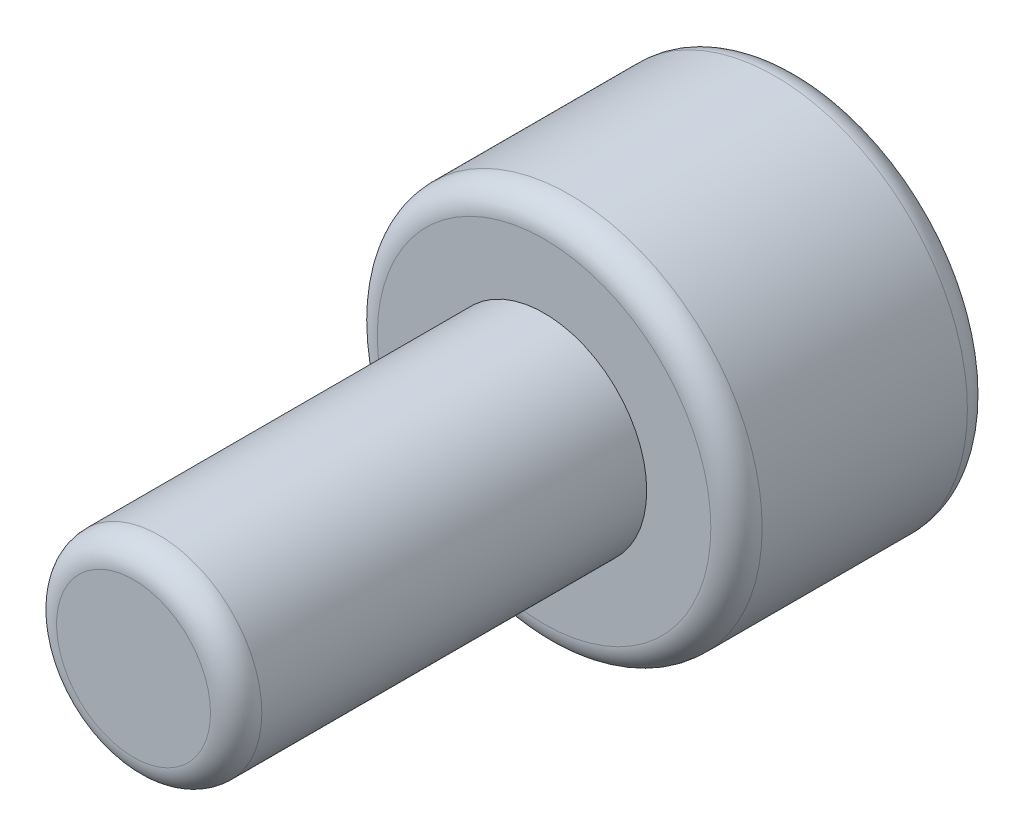
ISO-10303-21;
HEADER;
FILE_DESCRIPTION(('STEP AP214'),'2;1');
FILE_NAME('part.step','',(''),(''),'','','');
FILE_SCHEMA(('AUTOMOTIVE_DESIGN { 1 0 10303 214 1 1 1 1 }'));
ENDSEC;
DATA;
#1=APPLICATION_CONTEXT('core data for automotive mechanical design processes');
#2=APPLICATION_PROTOCOL_DEFINITION('international standard','automotive_design',2000,#1);
#3=PRODUCT_CONTEXT('',#1,'mechanical');
#4=PRODUCT('Part','Part','',(#3));
#5=PRODUCT_RELATED_PRODUCT_CATEGORY('part','',(#4));
#6=PRODUCT_DEFINITION_FORMATION('','',#4);
#7=PRODUCT_DEFINITION_CONTEXT('part definition',#1,'design');
#8=PRODUCT_DEFINITION('design','',#6,#7);
#9=PRODUCT_DEFINITION_SHAPE('','',#8);
#10=(LENGTH_UNIT() NAMED_UNIT(*) SI_UNIT(.MILLI.,.METRE.));
#11=(NAMED_UNIT(*) PLANE_ANGLE_UNIT() SI_UNIT($,.RADIAN.));
#12=(NAMED_UNIT(*) SI_UNIT($,.STERADIAN.) SOLID_ANGLE_UNIT());
#13=UNCERTAINTY_MEASURE_WITH_UNIT(LENGTH_MEASURE(1.E-05),#10,'distance_accuracy_value','');
#14=(GEOMETRIC_REPRESENTATION_CONTEXT(3) GLOBAL_UNCERTAINTY_ASSIGNED_CONTEXT((#13)) GLOBAL_UNIT_ASSIGNED_CONTEXT((#10,
#11,#12)) REPRESENTATION_CONTEXT('',''));
#15=CARTESIAN_POINT('',(0.,0.,0.));
#16=DIRECTION('',(0.,0.,1.));
#17=DIRECTION('',(1.,0.,0.));
#18=AXIS2_PLACEMENT_3D('',#15,#16,#17);
#19=CARTESIAN_POINT('',(0.,0.,8.));
#20=DIRECTION('',(0.,0.,-1.));
#21=DIRECTION('',(-1.,0.,0.));
#22=AXIS2_PLACEMENT_3D('',#19,#20,#21);
#23=CYLINDRICAL_SURFACE('',#22,2.);
#24=CARTESIAN_POINT('',(0.,0.,7.5));
#25=DIRECTION('',(0.,0.,1.));
#26=DIRECTION('',(1.,0.,0.));
#27=AXIS2_PLACEMENT_3D('',#24,#25,#26);
#28=CIRCLE('',#27,2.);
#29=CARTESIAN_POINT('',(2.,0.,7.5));
#30=VERTEX_POINT('',#29);
#31=EDGE_CURVE('E144',#30,#30,#28,.F.);
#32=ORIENTED_EDGE('',*,*,#31,.T.);
#33=EDGE_LOOP('',(#32));
#34=FACE_BOUND('',#33,.T.);
#35=CARTESIAN_POINT('',(0.,0.,0.));
#36=DIRECTION('',(0.,0.,1.));
#37=DIRECTION('',(1.,0.,0.));
#38=AXIS2_PLACEMENT_3D('',#35,#36,#37);
#39=CIRCLE('',#38,2.);
#40=CARTESIAN_POINT('',(2.,0.,0.));
#41=VERTEX_POINT('',#40);
#42=EDGE_CURVE('E178',#41,#41,#39,.T.);
#43=ORIENTED_EDGE('',*,*,#42,.T.);
#44=EDGE_LOOP('',(#43));
#45=FACE_BOUND('',#44,.T.);
#46=ADVANCED_FACE('F45',(#34,#45),#23,.T.);
#47=CARTESIAN_POINT('',(0.,0.,8.));
#48=DIRECTION('',(0.,0.,1.));
#49=DIRECTION('',(1.,0.,0.));
#50=AXIS2_PLACEMENT_3D('',#47,#48,#49);
#51=PLANE('',#50);
#52=CARTESIAN_POINT('',(0.,0.,8.));
#53=DIRECTION('',(0.,0.,1.));
#54=DIRECTION('',(1.,0.,0.));
#55=AXIS2_PLACEMENT_3D('',#52,#53,#54);
#56=CIRCLE('',#55,1.5);
#57=CARTESIAN_POINT('',(1.5,0.,8.));
#58=VERTEX_POINT('',#57);
#59=EDGE_CURVE('E251',#58,#58,#56,.T.);
#60=ORIENTED_EDGE('',*,*,#59,.T.);
#61=EDGE_LOOP('',(#60));
#62=FACE_BOUND('',#61,.T.);
#63=ADVANCED_FACE('F316',(#62),#51,.T.);
#64=CARTESIAN_POINT('',(0.,0.,-5.));
#65=DIRECTION('',(0.,0.,1.));
#66=DIRECTION('',(1.,0.,0.));
#67=AXIS2_PLACEMENT_3D('',#64,#65,#66);
#68=CYLINDRICAL_SURFACE('',#67,3.75);
#69=CARTESIAN_POINT('',(0.,0.,-4.5));
#70=DIRECTION('',(0.,0.,-1.));
#71=DIRECTION('',(-1.,0.,0.));
#72=AXIS2_PLACEMENT_3D('',#69,#70,#71);
#73=CIRCLE('',#72,3.75);
#74=CARTESIAN_POINT('',(-3.75,0.,-4.5));
#75=VERTEX_POINT('',#74);
#76=EDGE_CURVE('E243',#75,#75,#73,.F.);
#77=ORIENTED_EDGE('',*,*,#76,.T.);
#78=EDGE_LOOP('',(#77));
#79=FACE_BOUND('',#78,.T.);
#80=CARTESIAN_POINT('',(0.,0.,-0.5));
#81=DIRECTION('',(0.,0.,-1.));
#82=DIRECTION('',(-1.,0.,0.));
#83=AXIS2_PLACEMENT_3D('',#80,#81,#82);
#84=CIRCLE('',#83,3.75);
#85=CARTESIAN_POINT('',(-3.75,0.,-0.5));
#86=VERTEX_POINT('',#85);
#87=EDGE_CURVE('E239',#86,#86,#84,.T.);
#88=ORIENTED_EDGE('',*,*,#87,.T.);
#89=EDGE_LOOP('',(#88));
#90=FACE_BOUND('',#89,.T.);
#91=ADVANCED_FACE('F322',(#79,#90),#68,.T.);
#92=CARTESIAN_POINT('',(0.,0.,-5.));
#93=DIRECTION('',(0.,0.,-1.));
#94=DIRECTION('',(-1.,0.,0.));
#95=AXIS2_PLACEMENT_3D('',#92,#93,#94);
#96=PLANE('',#95);
#97=CARTESIAN_POINT('',(0.,0.,-5.));
#98=DIRECTION('',(0.,0.,-1.));
#99=DIRECTION('',(-1.,0.,0.));
#100=AXIS2_PLACEMENT_3D('',#97,#98,#99);
#101=CIRCLE('',#100,3.25);
#102=CARTESIAN_POINT('',(-3.25,0.,-5.));
#103=VERTEX_POINT('',#102);
#104=EDGE_CURVE('E235',#103,#103,#101,.T.);
#105=ORIENTED_EDGE('',*,*,#104,.T.);
#106=EDGE_LOOP('',(#105));
#107=FACE_BOUND('',#106,.T.);
#108=DIRECTION('',(0.5,0.866025403784438,0.));
#109=VECTOR('',#108,1.);
#110=CARTESIAN_POINT('',(-1.4,2.42487113059643,-5.));
#111=LINE('',#110,#109);
#112=CARTESIAN_POINT('',(-2.65566243270259,0.250000000000001,-5.));
#113=VERTEX_POINT('',#112);
#114=CARTESIAN_POINT('',(-1.54433756729741,2.17487113059643,-5.));
#115=VERTEX_POINT('',#114);
#116=EDGE_CURVE('E290',#113,#115,#111,.T.);
#117=ORIENTED_EDGE('',*,*,#116,.F.);
#118=CARTESIAN_POINT('',(-2.22264973081037,0.,-5.));
#119=DIRECTION('',(0.,0.,-1.));
#120=DIRECTION('',(-1.,0.,0.));
#121=AXIS2_PLACEMENT_3D('',#118,#119,#120);
#122=CIRCLE('',#121,0.5);
#123=CARTESIAN_POINT('',(-2.65566243270259,-0.249999999999999,-5.));
#124=VERTEX_POINT('',#123);
#125=EDGE_CURVE('E263',#113,#124,#122,.F.);
#126=ORIENTED_EDGE('',*,*,#125,.T.);
#127=DIRECTION('',(-0.5,0.866025403784439,0.));
#128=VECTOR('',#127,1.);
#129=CARTESIAN_POINT('',(-2.8,0.,-5.));
#130=LINE('',#129,#128);
#131=CARTESIAN_POINT('',(-1.54433756729741,-2.17487113059643,-5.));
#132=VERTEX_POINT('',#131);
#133=EDGE_CURVE('E168',#132,#124,#130,.T.);
#134=ORIENTED_EDGE('',*,*,#133,.F.);
#135=CARTESIAN_POINT('',(-1.11132486540519,-1.92487113059643,-5.));
#136=DIRECTION('',(0.,0.,-1.));
#137=DIRECTION('',(-1.,0.,0.));
#138=AXIS2_PLACEMENT_3D('',#135,#136,#137);
#139=CIRCLE('',#138,0.5);
#140=CARTESIAN_POINT('',(-1.11132486540519,-2.42487113059643,-5.));
#141=VERTEX_POINT('',#140);
#142=EDGE_CURVE('E260',#132,#141,#139,.F.);
#143=ORIENTED_EDGE('',*,*,#142,.T.);
#144=DIRECTION('',(-1.,0.,0.));
#145=VECTOR('',#144,1.);
#146=CARTESIAN_POINT('',(-1.4,-2.42487113059643,-5.));
#147=LINE('',#146,#145);
#148=CARTESIAN_POINT('',(1.11132486540519,-2.42487113059643,-5.));
#149=VERTEX_POINT('',#148);
#150=EDGE_CURVE('E162',#149,#141,#147,.T.);
#151=ORIENTED_EDGE('',*,*,#150,.F.);
#152=CARTESIAN_POINT('',(1.11132486540519,-1.92487113059643,-5.));
#153=DIRECTION('',(0.,0.,-1.));
#154=DIRECTION('',(-1.,0.,0.));
#155=AXIS2_PLACEMENT_3D('',#152,#153,#154);
#156=CIRCLE('',#155,0.5);
#157=CARTESIAN_POINT('',(1.5443375672974,-2.17487113059643,-5.));
#158=VERTEX_POINT('',#157);
#159=EDGE_CURVE('E143',#149,#158,#156,.F.);
#160=ORIENTED_EDGE('',*,*,#159,.T.);
#161=DIRECTION('',(-0.500000000000001,-0.866025403784438,0.));
#162=VECTOR('',#161,1.);
#163=CARTESIAN_POINT('',(1.4,-2.42487113059643,-5.));
#164=LINE('',#163,#162);
#165=CARTESIAN_POINT('',(2.65566243270259,-0.250000000000001,-5.));
#166=VERTEX_POINT('',#165);
#167=EDGE_CURVE('E150',#166,#158,#164,.T.);
#168=ORIENTED_EDGE('',*,*,#167,.F.);
#169=CARTESIAN_POINT('',(2.22264973081037,0.,-5.));
#170=DIRECTION('',(0.,0.,-1.));
#171=DIRECTION('',(-1.,0.,0.));
#172=AXIS2_PLACEMENT_3D('',#169,#170,#171);
#173=CIRCLE('',#172,0.5);
#174=CARTESIAN_POINT('',(2.65566243270259,0.249999999999998,-5.));
#175=VERTEX_POINT('',#174);
#176=EDGE_CURVE('E134',#166,#175,#173,.F.);
#177=ORIENTED_EDGE('',*,*,#176,.T.);
#178=DIRECTION('',(0.5,-0.866025403784439,0.));
#179=VECTOR('',#178,1.);
#180=CARTESIAN_POINT('',(2.8,0.,-5.));
#181=LINE('',#180,#179);
#182=CARTESIAN_POINT('',(1.54433756729741,2.17487113059643,-5.));
#183=VERTEX_POINT('',#182);
#184=EDGE_CURVE('E163',#183,#175,#181,.T.);
#185=ORIENTED_EDGE('',*,*,#184,.F.);
#186=CARTESIAN_POINT('',(1.11132486540519,1.92487113059643,-5.));
#187=DIRECTION('',(0.,0.,-1.));
#188=DIRECTION('',(-1.,0.,0.));
#189=AXIS2_PLACEMENT_3D('',#186,#187,#188);
#190=CIRCLE('',#189,0.5);
#191=CARTESIAN_POINT('',(1.11132486540519,2.42487113059643,-5.));
#192=VERTEX_POINT('',#191);
#193=EDGE_CURVE('E54',#183,#192,#190,.F.);
#194=ORIENTED_EDGE('',*,*,#193,.T.);
#195=DIRECTION('',(1.,0.,0.));
#196=VECTOR('',#195,1.);
#197=CARTESIAN_POINT('',(1.4,2.42487113059643,-5.));
#198=LINE('',#197,#196);
#199=CARTESIAN_POINT('',(-1.11132486540519,2.42487113059643,-5.));
#200=VERTEX_POINT('',#199);
#201=EDGE_CURVE('E170',#200,#192,#198,.T.);
#202=ORIENTED_EDGE('',*,*,#201,.F.);
#203=CARTESIAN_POINT('',(-1.11132486540519,1.92487113059643,-5.));
#204=DIRECTION('',(0.,0.,-1.));
#205=DIRECTION('',(-1.,0.,0.));
#206=AXIS2_PLACEMENT_3D('',#203,#204,#205);
#207=CIRCLE('',#206,0.5);
#208=EDGE_CURVE('E11',#200,#115,#207,.F.);
#209=ORIENTED_EDGE('',*,*,#208,.T.);
#210=EDGE_LOOP('',(#117,#126,#134,#143,#151,#160,#168,#177,#185,#194,#202,#209));
#211=FACE_BOUND('',#210,.T.);
#212=ADVANCED_FACE('F159',(#107,#211),#96,.T.);
#213=CARTESIAN_POINT('',(0.,0.,0.));
#214=DIRECTION('',(0.,0.,-1.));
#215=DIRECTION('',(-1.,0.,0.));
#216=AXIS2_PLACEMENT_3D('',#213,#214,#215);
#217=PLANE('',#216);
#218=CARTESIAN_POINT('',(0.,0.,0.));
#219=DIRECTION('',(0.,0.,-1.));
#220=DIRECTION('',(-1.,0.,0.));
#221=AXIS2_PLACEMENT_3D('',#218,#219,#220);
#222=CIRCLE('',#221,3.25);
#223=CARTESIAN_POINT('',(-3.25,0.,0.));
#224=VERTEX_POINT('',#223);
#225=EDGE_CURVE('E247',#224,#224,#222,.F.);
#226=ORIENTED_EDGE('',*,*,#225,.T.);
#227=EDGE_LOOP('',(#226));
#228=FACE_BOUND('',#227,.T.);
#229=ORIENTED_EDGE('',*,*,#42,.F.);
#230=EDGE_LOOP('',(#229));
#231=FACE_BOUND('',#230,.T.);
#232=ADVANCED_FACE('F366',(#228,#231),#217,.F.);
#233=CARTESIAN_POINT('',(-1.4,2.42487113059643,-2.));
#234=DIRECTION('',(-0.866025403784438,0.5,0.));
#235=DIRECTION('',(-0.5,-0.866025403784439,0.));
#236=AXIS2_PLACEMENT_3D('',#233,#234,#235);
#237=PLANE('',#236);
#238=DIRECTION('',(0.5,0.866025403784438,0.));
#239=VECTOR('',#238,1.);
#240=CARTESIAN_POINT('',(-1.4,2.42487113059643,-2.));
#241=LINE('',#240,#239);
#242=CARTESIAN_POINT('',(-2.65566243270259,0.250000000000001,-2.));
#243=VERTEX_POINT('',#242);
#244=CARTESIAN_POINT('',(-1.54433756729741,2.17487113059643,-2.));
#245=VERTEX_POINT('',#244);
#246=EDGE_CURVE('E177',#243,#245,#241,.T.);
#247=ORIENTED_EDGE('',*,*,#246,.F.);
#248=DIRECTION('',(0.,0.,-1.));
#249=VECTOR('',#248,1.);
#250=CARTESIAN_POINT('',(-2.65566243270259,0.250000000000002,-5.));
#251=LINE('',#250,#249);
#252=EDGE_CURVE('E225',#243,#113,#251,.T.);
#253=ORIENTED_EDGE('',*,*,#252,.T.);
#254=ORIENTED_EDGE('',*,*,#116,.T.);
#255=DIRECTION('',(0.,0.,-1.));
#256=VECTOR('',#255,1.);
#257=CARTESIAN_POINT('',(-1.54433756729741,2.17487113059643,-2.));
#258=LINE('',#257,#256);
#259=EDGE_CURVE('E222',#115,#245,#258,.F.);
#260=ORIENTED_EDGE('',*,*,#259,.T.);
#261=EDGE_LOOP('',(#247,#253,#254,#260));
#262=FACE_BOUND('',#261,.T.);
#263=ADVANCED_FACE('F371',(#262),#237,.F.);
#264=CARTESIAN_POINT('',(-2.8,0.,-2.));
#265=DIRECTION('',(-0.866025403784439,-0.5,0.));
#266=DIRECTION('',(0.5,-0.866025403784439,0.));
#267=AXIS2_PLACEMENT_3D('',#264,#265,#266);
#268=PLANE('',#267);
#269=DIRECTION('',(-0.5,0.866025403784439,0.));
#270=VECTOR('',#269,1.);
#271=CARTESIAN_POINT('',(-2.8,0.,-2.));
#272=LINE('',#271,#270);
#273=CARTESIAN_POINT('',(-1.54433756729741,-2.17487113059643,-2.));
#274=VERTEX_POINT('',#273);
#275=CARTESIAN_POINT('',(-2.65566243270259,-0.249999999999999,-2.));
#276=VERTEX_POINT('',#275);
#277=EDGE_CURVE('E182',#274,#276,#272,.T.);
#278=ORIENTED_EDGE('',*,*,#277,.F.);
#279=DIRECTION('',(0.,0.,-1.));
#280=VECTOR('',#279,1.);
#281=CARTESIAN_POINT('',(-1.54433756729741,-2.17487113059643,-5.));
#282=LINE('',#281,#280);
#283=EDGE_CURVE('E218',#274,#132,#282,.T.);
#284=ORIENTED_EDGE('',*,*,#283,.T.);
#285=ORIENTED_EDGE('',*,*,#133,.T.);
#286=DIRECTION('',(0.,0.,-1.));
#287=VECTOR('',#286,1.);
#288=CARTESIAN_POINT('',(-2.65566243270259,-0.249999999999999,-2.));
#289=LINE('',#288,#287);
#290=EDGE_CURVE('E215',#124,#276,#289,.F.);
#291=ORIENTED_EDGE('',*,*,#290,.T.);
#292=EDGE_LOOP('',(#278,#284,#285,#291));
#293=FACE_BOUND('',#292,.T.);
#294=ADVANCED_FACE('F375',(#293),#268,.F.);
#295=CARTESIAN_POINT('',(-1.4,-2.42487113059643,-2.));
#296=DIRECTION('',(0.,-1.,0.));
#297=DIRECTION('',(1.,0.,0.));
#298=AXIS2_PLACEMENT_3D('',#295,#296,#297);
#299=PLANE('',#298);
#300=DIRECTION('',(-1.,0.,0.));
#301=VECTOR('',#300,1.);
#302=CARTESIAN_POINT('',(-1.4,-2.42487113059643,-2.));
#303=LINE('',#302,#301);
#304=CARTESIAN_POINT('',(1.11132486540519,-2.42487113059643,-2.));
#305=VERTEX_POINT('',#304);
#306=CARTESIAN_POINT('',(-1.11132486540519,-2.42487113059643,-2.));
#307=VERTEX_POINT('',#306);
#308=EDGE_CURVE('E269',#305,#307,#303,.T.);
#309=ORIENTED_EDGE('',*,*,#308,.F.);
#310=DIRECTION('',(0.,0.,-1.));
#311=VECTOR('',#310,1.);
#312=CARTESIAN_POINT('',(1.11132486540519,-2.42487113059643,-5.));
#313=LINE('',#312,#311);
#314=EDGE_CURVE('E211',#305,#149,#313,.T.);
#315=ORIENTED_EDGE('',*,*,#314,.T.);
#316=ORIENTED_EDGE('',*,*,#150,.T.);
#317=DIRECTION('',(0.,0.,-1.));
#318=VECTOR('',#317,1.);
#319=CARTESIAN_POINT('',(-1.11132486540519,-2.42487113059643,-2.));
#320=LINE('',#319,#318);
#321=EDGE_CURVE('E208',#141,#307,#320,.F.);
#322=ORIENTED_EDGE('',*,*,#321,.T.);
#323=EDGE_LOOP('',(#309,#315,#316,#322));
#324=FACE_BOUND('',#323,.T.);
#325=ADVANCED_FACE('F313',(#324),#299,.F.);
#326=CARTESIAN_POINT('',(1.4,-2.42487113059643,-2.));
#327=DIRECTION('',(0.866025403784438,-0.500000000000001,0.));
#328=DIRECTION('',(0.500000000000001,0.866025403784438,0.));
#329=AXIS2_PLACEMENT_3D('',#326,#327,#328);
#330=PLANE('',#329);
#331=DIRECTION('',(-0.500000000000001,-0.866025403784438,0.));
#332=VECTOR('',#331,1.);
#333=CARTESIAN_POINT('',(1.4,-2.42487113059643,-2.));
#334=LINE('',#333,#332);
#335=CARTESIAN_POINT('',(2.65566243270259,-0.250000000000001,-2.));
#336=VERTEX_POINT('',#335);
#337=CARTESIAN_POINT('',(1.5443375672974,-2.17487113059643,-2.));
#338=VERTEX_POINT('',#337);
#339=EDGE_CURVE('E153',#336,#338,#334,.T.);
#340=ORIENTED_EDGE('',*,*,#339,.F.);
#341=DIRECTION('',(0.,0.,-1.));
#342=VECTOR('',#341,1.);
#343=CARTESIAN_POINT('',(2.65566243270259,-0.250000000000002,-5.));
#344=LINE('',#343,#342);
#345=EDGE_CURVE('E138',#336,#166,#344,.T.);
#346=ORIENTED_EDGE('',*,*,#345,.T.);
#347=ORIENTED_EDGE('',*,*,#167,.T.);
#348=DIRECTION('',(0.,0.,-1.));
#349=VECTOR('',#348,1.);
#350=CARTESIAN_POINT('',(1.5443375672974,-2.17487113059643,-2.));
#351=LINE('',#350,#349);
#352=EDGE_CURVE('E156',#158,#338,#351,.F.);
#353=ORIENTED_EDGE('',*,*,#352,.T.);
#354=EDGE_LOOP('',(#340,#346,#347,#353));
#355=FACE_BOUND('',#354,.T.);
#356=ADVANCED_FACE('F149',(#355),#330,.F.);
#357=CARTESIAN_POINT('',(2.8,0.,-2.));
#358=DIRECTION('',(0.866025403784439,0.5,0.));
#359=DIRECTION('',(-0.5,0.866025403784439,0.));
#360=AXIS2_PLACEMENT_3D('',#357,#358,#359);
#361=PLANE('',#360);
#362=ORIENTED_EDGE('',*,*,#184,.T.);
#363=DIRECTION('',(0.,0.,-1.));
#364=VECTOR('',#363,1.);
#365=CARTESIAN_POINT('',(2.65566243270259,0.249999999999998,-2.));
#366=LINE('',#365,#364);
#367=CARTESIAN_POINT('',(2.65566243270259,0.249999999999998,-2.));
#368=VERTEX_POINT('',#367);
#369=EDGE_CURVE('E139',#175,#368,#366,.F.);
#370=ORIENTED_EDGE('',*,*,#369,.T.);
#371=DIRECTION('',(0.5,-0.866025403784439,0.));
#372=VECTOR('',#371,1.);
#373=CARTESIAN_POINT('',(2.8,0.,-2.));
#374=LINE('',#373,#372);
#375=CARTESIAN_POINT('',(1.54433756729741,2.17487113059643,-2.));
#376=VERTEX_POINT('',#375);
#377=EDGE_CURVE('E275',#376,#368,#374,.T.);
#378=ORIENTED_EDGE('',*,*,#377,.F.);
#379=DIRECTION('',(0.,0.,-1.));
#380=VECTOR('',#379,1.);
#381=CARTESIAN_POINT('',(1.54433756729741,2.17487113059643,-5.));
#382=LINE('',#381,#380);
#383=EDGE_CURVE('E155',#376,#183,#382,.T.);
#384=ORIENTED_EDGE('',*,*,#383,.T.);
#385=EDGE_LOOP('',(#362,#370,#378,#384));
#386=FACE_BOUND('',#385,.T.);
#387=ADVANCED_FACE('F305',(#386),#361,.F.);
#388=CARTESIAN_POINT('',(1.4,2.42487113059643,-2.));
#389=DIRECTION('',(0.,1.,0.));
#390=DIRECTION('',(-1.,0.,0.));
#391=AXIS2_PLACEMENT_3D('',#388,#389,#390);
#392=PLANE('',#391);
#393=ORIENTED_EDGE('',*,*,#201,.T.);
#394=DIRECTION('',(0.,0.,-1.));
#395=VECTOR('',#394,1.);
#396=CARTESIAN_POINT('',(1.11132486540519,2.42487113059643,-2.));
#397=LINE('',#396,#395);
#398=CARTESIAN_POINT('',(1.11132486540519,2.42487113059643,-2.));
#399=VERTEX_POINT('',#398);
#400=EDGE_CURVE('E232',#192,#399,#397,.F.);
#401=ORIENTED_EDGE('',*,*,#400,.T.);
#402=DIRECTION('',(1.,0.,0.));
#403=VECTOR('',#402,1.);
#404=CARTESIAN_POINT('',(1.4,2.42487113059643,-2.));
#405=LINE('',#404,#403);
#406=CARTESIAN_POINT('',(-1.11132486540519,2.42487113059643,-2.));
#407=VERTEX_POINT('',#406);
#408=EDGE_CURVE('E279',#407,#399,#405,.T.);
#409=ORIENTED_EDGE('',*,*,#408,.F.);
#410=DIRECTION('',(0.,0.,-1.));
#411=VECTOR('',#410,1.);
#412=CARTESIAN_POINT('',(-1.11132486540519,2.42487113059643,-5.));
#413=LINE('',#412,#411);
#414=EDGE_CURVE('E229',#407,#200,#413,.T.);
#415=ORIENTED_EDGE('',*,*,#414,.T.);
#416=EDGE_LOOP('',(#393,#401,#409,#415));
#417=FACE_BOUND('',#416,.T.);
#418=ADVANCED_FACE('F296',(#417),#392,.F.);
#419=CARTESIAN_POINT('',(0.,0.,-2.));
#420=DIRECTION('',(0.,0.,1.));
#421=DIRECTION('',(1.,0.,0.));
#422=AXIS2_PLACEMENT_3D('',#419,#420,#421);
#423=PLANE('',#422);
#424=ORIENTED_EDGE('',*,*,#377,.T.);
#425=CARTESIAN_POINT('',(2.22264973081037,0.,-2.));
#426=DIRECTION('',(0.,0.,1.));
#427=DIRECTION('',(1.,0.,0.));
#428=AXIS2_PLACEMENT_3D('',#425,#426,#427);
#429=CIRCLE('',#428,0.5);
#430=EDGE_CURVE('E205',#368,#336,#429,.F.);
#431=ORIENTED_EDGE('',*,*,#430,.T.);
#432=ORIENTED_EDGE('',*,*,#339,.T.);
#433=CARTESIAN_POINT('',(1.11132486540519,-1.92487113059643,-2.));
#434=DIRECTION('',(0.,0.,1.));
#435=DIRECTION('',(1.,0.,0.));
#436=AXIS2_PLACEMENT_3D('',#433,#434,#435);
#437=CIRCLE('',#436,0.5);
#438=EDGE_CURVE('E202',#338,#305,#437,.F.);
#439=ORIENTED_EDGE('',*,*,#438,.T.);
#440=ORIENTED_EDGE('',*,*,#308,.T.);
#441=CARTESIAN_POINT('',(-1.11132486540519,-1.92487113059643,-2.));
#442=DIRECTION('',(0.,0.,1.));
#443=DIRECTION('',(1.,0.,0.));
#444=AXIS2_PLACEMENT_3D('',#441,#442,#443);
#445=CIRCLE('',#444,0.5);
#446=EDGE_CURVE('E199',#307,#274,#445,.F.);
#447=ORIENTED_EDGE('',*,*,#446,.T.);
#448=ORIENTED_EDGE('',*,*,#277,.T.);
#449=CARTESIAN_POINT('',(-2.22264973081037,0.,-2.));
#450=DIRECTION('',(0.,0.,1.));
#451=DIRECTION('',(1.,0.,0.));
#452=AXIS2_PLACEMENT_3D('',#449,#450,#451);
#453=CIRCLE('',#452,0.5);
#454=EDGE_CURVE('E196',#276,#243,#453,.F.);
#455=ORIENTED_EDGE('',*,*,#454,.T.);
#456=ORIENTED_EDGE('',*,*,#246,.T.);
#457=CARTESIAN_POINT('',(-1.11132486540519,1.92487113059643,-2.));
#458=DIRECTION('',(0.,0.,1.));
#459=DIRECTION('',(1.,0.,0.));
#460=AXIS2_PLACEMENT_3D('',#457,#458,#459);
#461=CIRCLE('',#460,0.5);
#462=EDGE_CURVE('E190',#245,#407,#461,.F.);
#463=ORIENTED_EDGE('',*,*,#462,.T.);
#464=ORIENTED_EDGE('',*,*,#408,.T.);
#465=CARTESIAN_POINT('',(1.11132486540519,1.92487113059643,-2.));
#466=DIRECTION('',(0.,0.,1.));
#467=DIRECTION('',(1.,0.,0.));
#468=AXIS2_PLACEMENT_3D('',#465,#466,#467);
#469=CIRCLE('',#468,0.5);
#470=EDGE_CURVE('E193',#399,#376,#469,.F.);
#471=ORIENTED_EDGE('',*,*,#470,.T.);
#472=EDGE_LOOP('',(#424,#431,#432,#439,#440,#447,#448,#455,#456,#463,#464,#471));
#473=FACE_BOUND('',#472,.T.);
#474=ADVANCED_FACE('F303',(#473),#423,.F.);
#475=CARTESIAN_POINT('',(2.22264973081037,0.,-2.));
#476=DIRECTION('',(0.,0.,1.));
#477=DIRECTION('',(1.,0.,0.));
#478=AXIS2_PLACEMENT_3D('',#475,#476,#477);
#479=CYLINDRICAL_SURFACE('',#478,0.5);
#480=ORIENTED_EDGE('',*,*,#430,.F.);
#481=ORIENTED_EDGE('',*,*,#369,.F.);
#482=ORIENTED_EDGE('',*,*,#176,.F.);
#483=ORIENTED_EDGE('',*,*,#345,.F.);
#484=EDGE_LOOP('',(#480,#481,#482,#483));
#485=FACE_BOUND('',#484,.T.);
#486=ADVANCED_FACE('F137',(#485),#479,.F.);
#487=CARTESIAN_POINT('',(1.11132486540519,-1.92487113059643,-2.));
#488=DIRECTION('',(0.,0.,1.));
#489=DIRECTION('',(1.,0.,0.));
#490=AXIS2_PLACEMENT_3D('',#487,#488,#489);
#491=CYLINDRICAL_SURFACE('',#490,0.5);
#492=ORIENTED_EDGE('',*,*,#438,.F.);
#493=ORIENTED_EDGE('',*,*,#352,.F.);
#494=ORIENTED_EDGE('',*,*,#159,.F.);
#495=ORIENTED_EDGE('',*,*,#314,.F.);
#496=EDGE_LOOP('',(#492,#493,#494,#495));
#497=FACE_BOUND('',#496,.T.);
#498=ADVANCED_FACE('F330',(#497),#491,.F.);
#499=CARTESIAN_POINT('',(-1.11132486540519,-1.92487113059643,-2.));
#500=DIRECTION('',(0.,0.,1.));
#501=DIRECTION('',(1.,0.,0.));
#502=AXIS2_PLACEMENT_3D('',#499,#500,#501);
#503=CYLINDRICAL_SURFACE('',#502,0.5);
#504=ORIENTED_EDGE('',*,*,#446,.F.);
#505=ORIENTED_EDGE('',*,*,#321,.F.);
#506=ORIENTED_EDGE('',*,*,#142,.F.);
#507=ORIENTED_EDGE('',*,*,#283,.F.);
#508=EDGE_LOOP('',(#504,#505,#506,#507));
#509=FACE_BOUND('',#508,.T.);
#510=ADVANCED_FACE('F333',(#509),#503,.F.);
#511=CARTESIAN_POINT('',(-2.22264973081037,0.,-2.));
#512=DIRECTION('',(0.,0.,1.));
#513=DIRECTION('',(1.,0.,0.));
#514=AXIS2_PLACEMENT_3D('',#511,#512,#513);
#515=CYLINDRICAL_SURFACE('',#514,0.5);
#516=ORIENTED_EDGE('',*,*,#454,.F.);
#517=ORIENTED_EDGE('',*,*,#290,.F.);
#518=ORIENTED_EDGE('',*,*,#125,.F.);
#519=ORIENTED_EDGE('',*,*,#252,.F.);
#520=EDGE_LOOP('',(#516,#517,#518,#519));
#521=FACE_BOUND('',#520,.T.);
#522=ADVANCED_FACE('F337',(#521),#515,.F.);
#523=CARTESIAN_POINT('',(1.11132486540519,1.92487113059643,-2.));
#524=DIRECTION('',(0.,0.,1.));
#525=DIRECTION('',(1.,0.,0.));
#526=AXIS2_PLACEMENT_3D('',#523,#524,#525);
#527=CYLINDRICAL_SURFACE('',#526,0.5);
#528=ORIENTED_EDGE('',*,*,#470,.F.);
#529=ORIENTED_EDGE('',*,*,#400,.F.);
#530=ORIENTED_EDGE('',*,*,#193,.F.);
#531=ORIENTED_EDGE('',*,*,#383,.F.);
#532=EDGE_LOOP('',(#528,#529,#530,#531));
#533=FACE_BOUND('',#532,.T.);
#534=ADVANCED_FACE('F300',(#533),#527,.F.);
#535=CARTESIAN_POINT('',(-1.11132486540519,1.92487113059643,-2.));
#536=DIRECTION('',(0.,0.,1.));
#537=DIRECTION('',(1.,0.,0.));
#538=AXIS2_PLACEMENT_3D('',#535,#536,#537);
#539=CYLINDRICAL_SURFACE('',#538,0.5);
#540=ORIENTED_EDGE('',*,*,#462,.F.);
#541=ORIENTED_EDGE('',*,*,#259,.F.);
#542=ORIENTED_EDGE('',*,*,#208,.F.);
#543=ORIENTED_EDGE('',*,*,#414,.F.);
#544=EDGE_LOOP('',(#540,#541,#542,#543));
#545=FACE_BOUND('',#544,.T.);
#546=ADVANCED_FACE('F344',(#545),#539,.F.);
#547=CARTESIAN_POINT('',(0.,0.,-4.5));
#548=DIRECTION('',(0.,0.,-1.));
#549=DIRECTION('',(-1.,0.,0.));
#550=AXIS2_PLACEMENT_3D('',#547,#548,#549);
#551=TOROIDAL_SURFACE('',#550,3.25,0.5);
#552=ORIENTED_EDGE('',*,*,#76,.F.);
#553=EDGE_LOOP('',(#552));
#554=FACE_BOUND('',#553,.T.);
#555=ORIENTED_EDGE('',*,*,#104,.F.);
#556=EDGE_LOOP('',(#555));
#557=FACE_BOUND('',#556,.T.);
#558=ADVANCED_FACE('F347',(#554,#557),#551,.T.);
#559=CARTESIAN_POINT('',(0.,0.,-0.5));
#560=DIRECTION('',(0.,0.,-1.));
#561=DIRECTION('',(-1.,0.,0.));
#562=AXIS2_PLACEMENT_3D('',#559,#560,#561);
#563=TOROIDAL_SURFACE('',#562,3.25,0.5);
#564=ORIENTED_EDGE('',*,*,#225,.F.);
#565=EDGE_LOOP('',(#564));
#566=FACE_BOUND('',#565,.T.);
#567=ORIENTED_EDGE('',*,*,#87,.F.);
#568=EDGE_LOOP('',(#567));
#569=FACE_BOUND('',#568,.T.);
#570=ADVANCED_FACE('F349',(#566,#569),#563,.T.);
#571=CARTESIAN_POINT('',(0.,0.,7.5));
#572=DIRECTION('',(0.,0.,1.));
#573=DIRECTION('',(1.,0.,0.));
#574=AXIS2_PLACEMENT_3D('',#571,#572,#573);
#575=TOROIDAL_SURFACE('',#574,1.5,0.5);
#576=ORIENTED_EDGE('',*,*,#31,.F.);
#577=EDGE_LOOP('',(#576));
#578=FACE_BOUND('',#577,.T.);
#579=ORIENTED_EDGE('',*,*,#59,.F.);
#580=EDGE_LOOP('',(#579));
#581=FACE_BOUND('',#580,.T.);
#582=ADVANCED_FACE('F47',(#578,#581),#575,.T.);
#583=CLOSED_SHELL('',(#46,#63,#91,#212,#232,#263,#294,#325,#356,#387,#418,#474,#486,#498,#510,
#522,#534,#546,#558,#570,#582));
#584=MANIFOLD_SOLID_BREP('B2',#583);
#585=ADVANCED_BREP_SHAPE_REPRESENTATION('',(#18,#584),#14);
#586=SHAPE_DEFINITION_REPRESENTATION(#9,#585);
ENDSEC;
END-ISO-10303-21;
